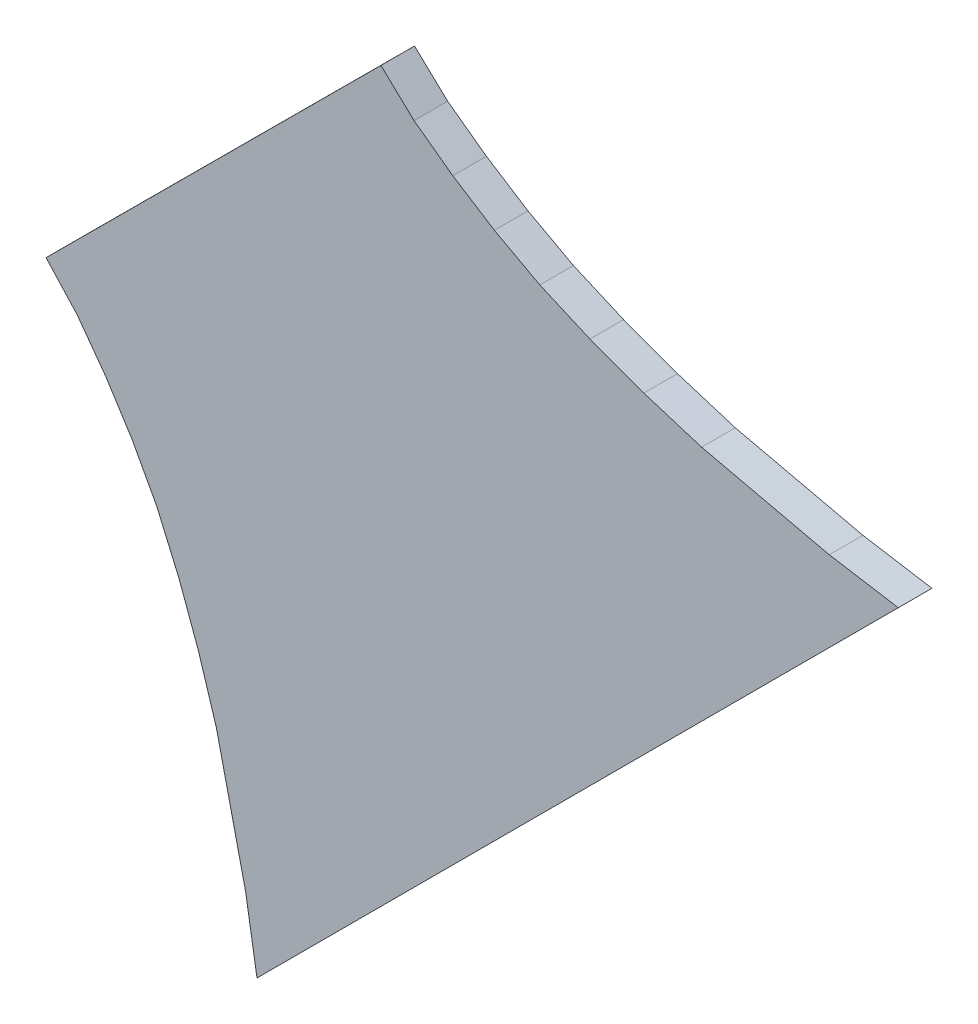
ISO-10303-21;
HEADER;
FILE_DESCRIPTION(('STEP AP214'),'2;1');
FILE_NAME('part.step','',(''),(''),'','','');
FILE_SCHEMA(('AUTOMOTIVE_DESIGN { 1 0 10303 214 1 1 1 1 }'));
ENDSEC;
DATA;
#1=APPLICATION_CONTEXT('core data for automotive mechanical design processes');
#2=APPLICATION_PROTOCOL_DEFINITION('international standard','automotive_design',2000,#1);
#3=PRODUCT_CONTEXT('',#1,'mechanical');
#4=PRODUCT('Part','Part','',(#3));
#5=PRODUCT_RELATED_PRODUCT_CATEGORY('part','',(#4));
#6=PRODUCT_DEFINITION_FORMATION('','',#4);
#7=PRODUCT_DEFINITION_CONTEXT('part definition',#1,'design');
#8=PRODUCT_DEFINITION('design','',#6,#7);
#9=PRODUCT_DEFINITION_SHAPE('','',#8);
#10=(LENGTH_UNIT() NAMED_UNIT(*) SI_UNIT(.MILLI.,.METRE.));
#11=(NAMED_UNIT(*) PLANE_ANGLE_UNIT() SI_UNIT($,.RADIAN.));
#12=(NAMED_UNIT(*) SI_UNIT($,.STERADIAN.) SOLID_ANGLE_UNIT());
#13=UNCERTAINTY_MEASURE_WITH_UNIT(LENGTH_MEASURE(1.E-05),#10,'distance_accuracy_value','');
#14=(GEOMETRIC_REPRESENTATION_CONTEXT(3) GLOBAL_UNCERTAINTY_ASSIGNED_CONTEXT((#13)) GLOBAL_UNIT_ASSIGNED_CONTEXT((#10,
#11,#12)) REPRESENTATION_CONTEXT('',''));
#15=CARTESIAN_POINT('',(0.,0.,0.));
#16=DIRECTION('',(0.,0.,1.));
#17=DIRECTION('',(1.,0.,0.));
#18=AXIS2_PLACEMENT_3D('',#15,#16,#17);
#19=CARTESIAN_POINT('',(119.383003234863,98.3040008544922,0.));
#20=DIRECTION('',(0.73721249970218,0.675660958086867,0.));
#21=DIRECTION('',(0.675660958086867,-0.73721249970218,0.));
#22=AXIS2_PLACEMENT_3D('',#19,#20,#21);
#23=PLANE('',#22);
#24=DIRECTION('',(0.675660958086867,-0.73721249970218,0.));
#25=VECTOR('',#24,1.);
#26=CARTESIAN_POINT('',(119.383003234863,98.3040008544922,0.03556));
#27=LINE('',#26,#25);
#28=CARTESIAN_POINT('',(119.383003234863,98.3040008544922,0.03556));
#29=VERTEX_POINT('',#28);
#30=CARTESIAN_POINT('',(119.416000366211,98.2679977416992,0.03556));
#31=VERTEX_POINT('',#30);
#32=EDGE_CURVE('E11',#29,#31,#27,.T.);
#33=ORIENTED_EDGE('',*,*,#32,.F.);
#34=DIRECTION('',(0.,0.,1.));
#35=VECTOR('',#34,1.);
#36=CARTESIAN_POINT('',(119.383003234863,98.3040008544922,0.));
#37=LINE('',#36,#35);
#38=CARTESIAN_POINT('',(119.383003234863,98.3040008544922,0.));
#39=VERTEX_POINT('',#38);
#40=EDGE_CURVE('E24',#39,#29,#37,.T.);
#41=ORIENTED_EDGE('',*,*,#40,.F.);
#42=DIRECTION('',(0.675660958086867,-0.73721249970218,0.));
#43=VECTOR('',#42,1.);
#44=CARTESIAN_POINT('',(119.383003234863,98.3040008544922,0.));
#45=LINE('',#44,#43);
#46=CARTESIAN_POINT('',(119.416000366211,98.2679977416992,0.));
#47=VERTEX_POINT('',#46);
#48=EDGE_CURVE('E172',#39,#47,#45,.T.);
#49=ORIENTED_EDGE('',*,*,#48,.T.);
#50=DIRECTION('',(0.,0.,1.));
#51=VECTOR('',#50,1.);
#52=CARTESIAN_POINT('',(119.416000366211,98.2679977416992,0.));
#53=LINE('',#52,#51);
#54=EDGE_CURVE('E37',#47,#31,#53,.T.);
#55=ORIENTED_EDGE('',*,*,#54,.T.);
#56=EDGE_LOOP('',(#33,#41,#49,#55));
#57=FACE_BOUND('',#56,.T.);
#58=ADVANCED_FACE('F17',(#57),#23,.F.);
#59=CARTESIAN_POINT('',(119.416000366211,98.2679977416992,0.));
#60=DIRECTION('',(0.807044289854115,0.590490909509933,0.));
#61=DIRECTION('',(0.590490909509933,-0.807044289854115,0.));
#62=AXIS2_PLACEMENT_3D('',#59,#60,#61);
#63=PLANE('',#62);
#64=DIRECTION('',(0.590490909509933,-0.807044289854115,0.));
#65=VECTOR('',#64,1.);
#66=CARTESIAN_POINT('',(119.416000366211,98.2679977416992,0.03556));
#67=LINE('',#66,#65);
#68=CARTESIAN_POINT('',(119.445999145508,98.2269973754883,0.03556));
#69=VERTEX_POINT('',#68);
#70=EDGE_CURVE('E308',#31,#69,#67,.T.);
#71=ORIENTED_EDGE('',*,*,#70,.F.);
#72=ORIENTED_EDGE('',*,*,#54,.F.);
#73=DIRECTION('',(0.590490909509933,-0.807044289854115,0.));
#74=VECTOR('',#73,1.);
#75=CARTESIAN_POINT('',(119.416000366211,98.2679977416992,0.));
#76=LINE('',#75,#74);
#77=CARTESIAN_POINT('',(119.445999145508,98.2269973754883,0.));
#78=VERTEX_POINT('',#77);
#79=EDGE_CURVE('E305',#47,#78,#76,.T.);
#80=ORIENTED_EDGE('',*,*,#79,.T.);
#81=DIRECTION('',(0.,0.,1.));
#82=VECTOR('',#81,1.);
#83=CARTESIAN_POINT('',(119.445999145508,98.2269973754883,0.));
#84=LINE('',#83,#82);
#85=EDGE_CURVE('E303',#78,#69,#84,.T.);
#86=ORIENTED_EDGE('',*,*,#85,.T.);
#87=EDGE_LOOP('',(#71,#72,#80,#86));
#88=FACE_BOUND('',#87,.T.);
#89=ADVANCED_FACE('F316',(#88),#63,.F.);
#90=CARTESIAN_POINT('',(119.445999145508,98.2269973754883,0.));
#91=DIRECTION('',(0.84365546396574,0.536884957994497,0.));
#92=DIRECTION('',(0.536884957994497,-0.84365546396574,0.));
#93=AXIS2_PLACEMENT_3D('',#90,#91,#92);
#94=PLANE('',#93);
#95=DIRECTION('',(0.536884957994497,-0.84365546396574,0.));
#96=VECTOR('',#95,1.);
#97=CARTESIAN_POINT('',(119.445999145508,98.2269973754883,0.03556));
#98=LINE('',#97,#96);
#99=CARTESIAN_POINT('',(119.473999023438,98.1829986572266,0.03556));
#100=VERTEX_POINT('',#99);
#101=EDGE_CURVE('E300',#69,#100,#98,.T.);
#102=ORIENTED_EDGE('',*,*,#101,.F.);
#103=ORIENTED_EDGE('',*,*,#85,.F.);
#104=DIRECTION('',(0.536884957994497,-0.84365546396574,0.));
#105=VECTOR('',#104,1.);
#106=CARTESIAN_POINT('',(119.445999145508,98.2269973754883,0.));
#107=LINE('',#106,#105);
#108=CARTESIAN_POINT('',(119.473999023438,98.1829986572266,0.));
#109=VERTEX_POINT('',#108);
#110=EDGE_CURVE('E297',#78,#109,#107,.T.);
#111=ORIENTED_EDGE('',*,*,#110,.T.);
#112=DIRECTION('',(0.,0.,1.));
#113=VECTOR('',#112,1.);
#114=CARTESIAN_POINT('',(119.473999023438,98.1829986572266,0.));
#115=LINE('',#114,#113);
#116=EDGE_CURVE('E295',#109,#100,#115,.T.);
#117=ORIENTED_EDGE('',*,*,#116,.T.);
#118=EDGE_LOOP('',(#102,#103,#111,#117));
#119=FACE_BOUND('',#118,.T.);
#120=ADVANCED_FACE('F322',(#119),#94,.F.);
#121=CARTESIAN_POINT('',(119.473999023438,98.1829986572266,0.));
#122=DIRECTION('',(0.879270015722156,0.476323670891926,0.));
#123=DIRECTION('',(0.476323670891926,-0.879270015722156,0.));
#124=AXIS2_PLACEMENT_3D('',#121,#122,#123);
#125=PLANE('',#124);
#126=DIRECTION('',(0.476323670891926,-0.879270015722156,0.));
#127=VECTOR('',#126,1.);
#128=CARTESIAN_POINT('',(119.473999023438,98.1829986572266,0.03556));
#129=LINE('',#128,#127);
#130=CARTESIAN_POINT('',(119.5,98.1350021362305,0.03556));
#131=VERTEX_POINT('',#130);
#132=EDGE_CURVE('E292',#100,#131,#129,.T.);
#133=ORIENTED_EDGE('',*,*,#132,.F.);
#134=ORIENTED_EDGE('',*,*,#116,.F.);
#135=DIRECTION('',(0.476323670891926,-0.879270015722156,0.));
#136=VECTOR('',#135,1.);
#137=CARTESIAN_POINT('',(119.473999023438,98.1829986572266,0.));
#138=LINE('',#137,#136);
#139=CARTESIAN_POINT('',(119.5,98.1350021362305,0.));
#140=VERTEX_POINT('',#139);
#141=EDGE_CURVE('E289',#109,#140,#138,.T.);
#142=ORIENTED_EDGE('',*,*,#141,.T.);
#143=DIRECTION('',(0.,0.,1.));
#144=VECTOR('',#143,1.);
#145=CARTESIAN_POINT('',(119.5,98.1350021362305,0.));
#146=LINE('',#145,#144);
#147=EDGE_CURVE('E287',#140,#131,#146,.T.);
#148=ORIENTED_EDGE('',*,*,#147,.T.);
#149=EDGE_LOOP('',(#133,#134,#142,#148));
#150=FACE_BOUND('',#149,.T.);
#151=ADVANCED_FACE('F324',(#150),#125,.F.);
#152=CARTESIAN_POINT('',(119.5,98.1350021362305,0.));
#153=DIRECTION('',(0.917332272694855,0.398122470444075,0.));
#154=DIRECTION('',(0.398122470444075,-0.917332272694855,0.));
#155=AXIS2_PLACEMENT_3D('',#152,#153,#154);
#156=PLANE('',#155);
#157=DIRECTION('',(0.398122470444075,-0.917332272694855,0.));
#158=VECTOR('',#157,1.);
#159=CARTESIAN_POINT('',(119.5,98.1350021362305,0.03556));
#160=LINE('',#159,#158);
#161=CARTESIAN_POINT('',(119.523002624512,98.0820007324219,0.03556));
#162=VERTEX_POINT('',#161);
#163=EDGE_CURVE('E284',#131,#162,#160,.T.);
#164=ORIENTED_EDGE('',*,*,#163,.F.);
#165=ORIENTED_EDGE('',*,*,#147,.F.);
#166=DIRECTION('',(0.398122470444075,-0.917332272694855,0.));
#167=VECTOR('',#166,1.);
#168=CARTESIAN_POINT('',(119.5,98.1350021362305,0.));
#169=LINE('',#168,#167);
#170=CARTESIAN_POINT('',(119.523002624512,98.0820007324219,0.));
#171=VERTEX_POINT('',#170);
#172=EDGE_CURVE('E281',#140,#171,#169,.T.);
#173=ORIENTED_EDGE('',*,*,#172,.T.);
#174=DIRECTION('',(0.,0.,1.));
#175=VECTOR('',#174,1.);
#176=CARTESIAN_POINT('',(119.523002624512,98.0820007324219,0.));
#177=LINE('',#176,#175);
#178=EDGE_CURVE('E279',#171,#162,#177,.T.);
#179=ORIENTED_EDGE('',*,*,#178,.T.);
#180=EDGE_LOOP('',(#164,#165,#173,#179));
#181=FACE_BOUND('',#180,.T.);
#182=ADVANCED_FACE('F329',(#181),#156,.F.);
#183=CARTESIAN_POINT('',(119.523002624512,98.0820007324219,0.));
#184=DIRECTION('',(0.938362414966103,0.345652973629597,0.));
#185=DIRECTION('',(0.345652973629597,-0.938362414966103,0.));
#186=AXIS2_PLACEMENT_3D('',#183,#184,#185);
#187=PLANE('',#186);
#188=DIRECTION('',(0.345652973629597,-0.938362414966103,0.));
#189=VECTOR('',#188,1.);
#190=CARTESIAN_POINT('',(119.523002624512,98.0820007324219,0.03556));
#191=LINE('',#190,#189);
#192=CARTESIAN_POINT('',(119.543998718262,98.0250015258789,0.03556));
#193=VERTEX_POINT('',#192);
#194=EDGE_CURVE('E276',#162,#193,#191,.T.);
#195=ORIENTED_EDGE('',*,*,#194,.F.);
#196=ORIENTED_EDGE('',*,*,#178,.F.);
#197=DIRECTION('',(0.345652973629597,-0.938362414966103,0.));
#198=VECTOR('',#197,1.);
#199=CARTESIAN_POINT('',(119.523002624512,98.0820007324219,0.));
#200=LINE('',#199,#198);
#201=CARTESIAN_POINT('',(119.543998718262,98.0250015258789,0.));
#202=VERTEX_POINT('',#201);
#203=EDGE_CURVE('E273',#171,#202,#200,.T.);
#204=ORIENTED_EDGE('',*,*,#203,.T.);
#205=DIRECTION('',(0.,0.,1.));
#206=VECTOR('',#205,1.);
#207=CARTESIAN_POINT('',(119.543998718262,98.0250015258789,0.));
#208=LINE('',#207,#206);
#209=EDGE_CURVE('E271',#202,#193,#208,.T.);
#210=ORIENTED_EDGE('',*,*,#209,.T.);
#211=EDGE_LOOP('',(#195,#196,#204,#210));
#212=FACE_BOUND('',#211,.T.);
#213=ADVANCED_FACE('F332',(#212),#187,.F.);
#214=CARTESIAN_POINT('',(119.543998718262,98.0250015258789,0.));
#215=DIRECTION('',(0.954743056267574,0.297431835062847,0.));
#216=DIRECTION('',(0.297431835062847,-0.954743056267574,0.));
#217=AXIS2_PLACEMENT_3D('',#214,#215,#216);
#218=PLANE('',#217);
#219=DIRECTION('',(0.297431835062847,-0.954743056267574,0.));
#220=VECTOR('',#219,1.);
#221=CARTESIAN_POINT('',(119.543998718262,98.0250015258789,0.03556));
#222=LINE('',#221,#220);
#223=CARTESIAN_POINT('',(119.563003540039,97.963996887207,0.03556));
#224=VERTEX_POINT('',#223);
#225=EDGE_CURVE('E268',#193,#224,#222,.T.);
#226=ORIENTED_EDGE('',*,*,#225,.F.);
#227=ORIENTED_EDGE('',*,*,#209,.F.);
#228=DIRECTION('',(0.297431835062847,-0.954743056267574,0.));
#229=VECTOR('',#228,1.);
#230=CARTESIAN_POINT('',(119.543998718262,98.0250015258789,0.));
#231=LINE('',#230,#229);
#232=CARTESIAN_POINT('',(119.563003540039,97.963996887207,0.));
#233=VERTEX_POINT('',#232);
#234=EDGE_CURVE('E265',#202,#233,#231,.T.);
#235=ORIENTED_EDGE('',*,*,#234,.T.);
#236=DIRECTION('',(0.,0.,1.));
#237=VECTOR('',#236,1.);
#238=CARTESIAN_POINT('',(119.563003540039,97.963996887207,0.));
#239=LINE('',#238,#237);
#240=EDGE_CURVE('E263',#233,#224,#239,.T.);
#241=ORIENTED_EDGE('',*,*,#240,.T.);
#242=EDGE_LOOP('',(#226,#227,#235,#241));
#243=FACE_BOUND('',#242,.T.);
#244=ADVANCED_FACE('F337',(#243),#218,.F.);
#245=CARTESIAN_POINT('',(119.563003540039,97.963996887207,0.));
#246=DIRECTION('',(0.97463478036029,0.223801351452688,0.));
#247=DIRECTION('',(0.223801351452688,-0.97463478036029,0.));
#248=AXIS2_PLACEMENT_3D('',#245,#246,#247);
#249=PLANE('',#248);
#250=DIRECTION('',(0.223801351452688,-0.97463478036029,0.));
#251=VECTOR('',#250,1.);
#252=CARTESIAN_POINT('',(119.563003540039,97.963996887207,0.03556));
#253=LINE('',#252,#251);
#254=CARTESIAN_POINT('',(119.59400177002,97.8290023803711,0.03556));
#255=VERTEX_POINT('',#254);
#256=EDGE_CURVE('E260',#224,#255,#253,.T.);
#257=ORIENTED_EDGE('',*,*,#256,.F.);
#258=ORIENTED_EDGE('',*,*,#240,.F.);
#259=DIRECTION('',(0.223801351452688,-0.97463478036029,0.));
#260=VECTOR('',#259,1.);
#261=CARTESIAN_POINT('',(119.563003540039,97.963996887207,0.));
#262=LINE('',#261,#260);
#263=CARTESIAN_POINT('',(119.59400177002,97.8290023803711,0.));
#264=VERTEX_POINT('',#263);
#265=EDGE_CURVE('E257',#233,#264,#262,.T.);
#266=ORIENTED_EDGE('',*,*,#265,.T.);
#267=DIRECTION('',(0.,0.,1.));
#268=VECTOR('',#267,1.);
#269=CARTESIAN_POINT('',(119.59400177002,97.8290023803711,0.));
#270=LINE('',#269,#268);
#271=EDGE_CURVE('E255',#264,#255,#270,.T.);
#272=ORIENTED_EDGE('',*,*,#271,.T.);
#273=EDGE_LOOP('',(#257,#258,#266,#272));
#274=FACE_BOUND('',#273,.T.);
#275=ADVANCED_FACE('F340',(#274),#249,.F.);
#276=CARTESIAN_POINT('',(119.59400177002,97.8290023803711,0.));
#277=DIRECTION('',(0.986756592381173,0.16220797573577,0.));
#278=DIRECTION('',(0.16220797573577,-0.986756592381173,0.));
#279=AXIS2_PLACEMENT_3D('',#276,#277,#278);
#280=PLANE('',#279);
#281=DIRECTION('',(0.16220797573577,-0.986756592381173,0.));
#282=VECTOR('',#281,1.);
#283=CARTESIAN_POINT('',(119.59400177002,97.8290023803711,0.03556));
#284=LINE('',#283,#282);
#285=CARTESIAN_POINT('',(119.606002807617,97.7559967041016,0.03556));
#286=VERTEX_POINT('',#285);
#287=EDGE_CURVE('E252',#255,#286,#284,.T.);
#288=ORIENTED_EDGE('',*,*,#287,.F.);
#289=ORIENTED_EDGE('',*,*,#271,.F.);
#290=DIRECTION('',(0.16220797573577,-0.986756592381173,0.));
#291=VECTOR('',#290,1.);
#292=CARTESIAN_POINT('',(119.59400177002,97.8290023803711,0.));
#293=LINE('',#292,#291);
#294=CARTESIAN_POINT('',(119.606002807617,97.7559967041016,0.));
#295=VERTEX_POINT('',#294);
#296=EDGE_CURVE('E249',#264,#295,#293,.T.);
#297=ORIENTED_EDGE('',*,*,#296,.T.);
#298=DIRECTION('',(0.,0.,1.));
#299=VECTOR('',#298,1.);
#300=CARTESIAN_POINT('',(119.606002807617,97.7559967041016,0.));
#301=LINE('',#300,#299);
#302=EDGE_CURVE('E247',#295,#286,#301,.T.);
#303=ORIENTED_EDGE('',*,*,#302,.T.);
#304=EDGE_LOOP('',(#288,#289,#297,#303));
#305=FACE_BOUND('',#304,.T.);
#306=ADVANCED_FACE('F345',(#305),#280,.F.);
#307=CARTESIAN_POINT('',(119.606002807617,97.7559967041016,0.));
#308=DIRECTION('',(-0.707110759653078,0.707102802697632,0.));
#309=DIRECTION('',(0.707102802697632,0.707110759653078,0.));
#310=AXIS2_PLACEMENT_3D('',#307,#308,#309);
#311=PLANE('',#310);
#312=DIRECTION('',(0.707102802697632,0.707110759653078,0.));
#313=VECTOR('',#312,1.);
#314=CARTESIAN_POINT('',(119.606002807617,97.7559967041016,0.03556));
#315=LINE('',#314,#313);
#316=CARTESIAN_POINT('',(120.283996582031,98.4339981079102,0.03556));
#317=VERTEX_POINT('',#316);
#318=EDGE_CURVE('E244',#286,#317,#315,.T.);
#319=ORIENTED_EDGE('',*,*,#318,.F.);
#320=ORIENTED_EDGE('',*,*,#302,.F.);
#321=DIRECTION('',(0.707102802697632,0.707110759653078,0.));
#322=VECTOR('',#321,1.);
#323=CARTESIAN_POINT('',(119.606002807617,97.7559967041016,0.));
#324=LINE('',#323,#322);
#325=CARTESIAN_POINT('',(120.283996582031,98.4339981079102,0.));
#326=VERTEX_POINT('',#325);
#327=EDGE_CURVE('E241',#295,#326,#324,.T.);
#328=ORIENTED_EDGE('',*,*,#327,.T.);
#329=DIRECTION('',(0.,0.,1.));
#330=VECTOR('',#329,1.);
#331=CARTESIAN_POINT('',(120.283996582031,98.4339981079102,0.));
#332=LINE('',#331,#330);
#333=EDGE_CURVE('E239',#326,#317,#332,.T.);
#334=ORIENTED_EDGE('',*,*,#333,.T.);
#335=EDGE_LOOP('',(#319,#320,#328,#334));
#336=FACE_BOUND('',#335,.T.);
#337=ADVANCED_FACE('F348',(#336),#311,.F.);
#338=CARTESIAN_POINT('',(120.283996582031,98.4339981079102,0.));
#339=DIRECTION('',(-0.162224482780174,-0.98675387872899,0.));
#340=DIRECTION('',(-0.98675387872899,0.162224482780174,0.));
#341=AXIS2_PLACEMENT_3D('',#338,#339,#340);
#342=PLANE('',#341);
#343=DIRECTION('',(-0.98675387872899,0.162224482780174,0.));
#344=VECTOR('',#343,1.);
#345=CARTESIAN_POINT('',(120.283996582031,98.4339981079102,0.03556));
#346=LINE('',#345,#344);
#347=CARTESIAN_POINT('',(120.210998535156,98.4459991455078,0.03556));
#348=VERTEX_POINT('',#347);
#349=EDGE_CURVE('E236',#317,#348,#346,.T.);
#350=ORIENTED_EDGE('',*,*,#349,.F.);
#351=ORIENTED_EDGE('',*,*,#333,.F.);
#352=DIRECTION('',(-0.98675387872899,0.162224482780174,0.));
#353=VECTOR('',#352,1.);
#354=CARTESIAN_POINT('',(120.283996582031,98.4339981079102,0.));
#355=LINE('',#354,#353);
#356=CARTESIAN_POINT('',(120.210998535156,98.4459991455078,0.));
#357=VERTEX_POINT('',#356);
#358=EDGE_CURVE('E233',#326,#357,#355,.T.);
#359=ORIENTED_EDGE('',*,*,#358,.T.);
#360=DIRECTION('',(0.,0.,1.));
#361=VECTOR('',#360,1.);
#362=CARTESIAN_POINT('',(120.210998535156,98.4459991455078,0.));
#363=LINE('',#362,#361);
#364=EDGE_CURVE('E231',#357,#348,#363,.T.);
#365=ORIENTED_EDGE('',*,*,#364,.T.);
#366=EDGE_LOOP('',(#350,#351,#359,#365));
#367=FACE_BOUND('',#366,.T.);
#368=ADVANCED_FACE('F353',(#367),#342,.F.);
#369=CARTESIAN_POINT('',(120.210998535156,98.4459991455078,0.));
#370=DIRECTION('',(-0.223789337171493,-0.97463753907201,0.));
#371=DIRECTION('',(-0.97463753907201,0.223789337171493,0.));
#372=AXIS2_PLACEMENT_3D('',#369,#370,#371);
#373=PLANE('',#372);
#374=DIRECTION('',(-0.97463753907201,0.223789337171493,0.));
#375=VECTOR('',#374,1.);
#376=CARTESIAN_POINT('',(120.210998535156,98.4459991455078,0.03556));
#377=LINE('',#376,#375);
#378=CARTESIAN_POINT('',(120.075996398926,98.4769973754883,0.03556));
#379=VERTEX_POINT('',#378);
#380=EDGE_CURVE('E228',#348,#379,#377,.T.);
#381=ORIENTED_EDGE('',*,*,#380,.F.);
#382=ORIENTED_EDGE('',*,*,#364,.F.);
#383=DIRECTION('',(-0.97463753907201,0.223789337171493,0.));
#384=VECTOR('',#383,1.);
#385=CARTESIAN_POINT('',(120.210998535156,98.4459991455078,0.));
#386=LINE('',#385,#384);
#387=CARTESIAN_POINT('',(120.075996398926,98.4769973754883,0.));
#388=VERTEX_POINT('',#387);
#389=EDGE_CURVE('E225',#357,#388,#386,.T.);
#390=ORIENTED_EDGE('',*,*,#389,.T.);
#391=DIRECTION('',(0.,0.,1.));
#392=VECTOR('',#391,1.);
#393=CARTESIAN_POINT('',(120.075996398926,98.4769973754883,0.));
#394=LINE('',#393,#392);
#395=EDGE_CURVE('E223',#388,#379,#394,.T.);
#396=ORIENTED_EDGE('',*,*,#395,.T.);
#397=EDGE_LOOP('',(#381,#382,#390,#396));
#398=FACE_BOUND('',#397,.T.);
#399=ADVANCED_FACE('F356',(#398),#373,.F.);
#400=CARTESIAN_POINT('',(120.075996398926,98.4769973754883,0.));
#401=DIRECTION('',(-0.297465745609508,-0.954732491428347,0.));
#402=DIRECTION('',(-0.954732491428347,0.297465745609508,0.));
#403=AXIS2_PLACEMENT_3D('',#400,#401,#402);
#404=PLANE('',#403);
#405=DIRECTION('',(-0.954732491428347,0.297465745609508,0.));
#406=VECTOR('',#405,1.);
#407=CARTESIAN_POINT('',(120.075996398926,98.4769973754883,0.03556));
#408=LINE('',#407,#406);
#409=CARTESIAN_POINT('',(120.014999389648,98.4960021972656,0.03556));
#410=VERTEX_POINT('',#409);
#411=EDGE_CURVE('E220',#379,#410,#408,.T.);
#412=ORIENTED_EDGE('',*,*,#411,.F.);
#413=ORIENTED_EDGE('',*,*,#395,.F.);
#414=DIRECTION('',(-0.954732491428347,0.297465745609508,0.));
#415=VECTOR('',#414,1.);
#416=CARTESIAN_POINT('',(120.075996398926,98.4769973754883,0.));
#417=LINE('',#416,#415);
#418=CARTESIAN_POINT('',(120.014999389648,98.4960021972656,0.));
#419=VERTEX_POINT('',#418);
#420=EDGE_CURVE('E217',#388,#419,#417,.T.);
#421=ORIENTED_EDGE('',*,*,#420,.T.);
#422=DIRECTION('',(0.,0.,1.));
#423=VECTOR('',#422,1.);
#424=CARTESIAN_POINT('',(120.014999389648,98.4960021972656,0.));
#425=LINE('',#424,#423);
#426=EDGE_CURVE('E215',#419,#410,#425,.T.);
#427=ORIENTED_EDGE('',*,*,#426,.T.);
#428=EDGE_LOOP('',(#412,#413,#421,#427));
#429=FACE_BOUND('',#428,.T.);
#430=ADVANCED_FACE('F361',(#429),#404,.F.);
#431=CARTESIAN_POINT('',(120.014999389648,98.4960021972656,0.));
#432=DIRECTION('',(-0.345652973629597,-0.938362414966103,0.));
#433=DIRECTION('',(-0.938362414966103,0.345652973629597,0.));
#434=AXIS2_PLACEMENT_3D('',#431,#432,#433);
#435=PLANE('',#434);
#436=DIRECTION('',(-0.938362414966103,0.345652973629597,0.));
#437=VECTOR('',#436,1.);
#438=CARTESIAN_POINT('',(120.014999389648,98.4960021972656,0.03556));
#439=LINE('',#438,#437);
#440=CARTESIAN_POINT('',(119.958000183105,98.5169982910156,0.03556));
#441=VERTEX_POINT('',#440);
#442=EDGE_CURVE('E212',#410,#441,#439,.T.);
#443=ORIENTED_EDGE('',*,*,#442,.F.);
#444=ORIENTED_EDGE('',*,*,#426,.F.);
#445=DIRECTION('',(-0.938362414966103,0.345652973629597,0.));
#446=VECTOR('',#445,1.);
#447=CARTESIAN_POINT('',(120.014999389648,98.4960021972656,0.));
#448=LINE('',#447,#446);
#449=CARTESIAN_POINT('',(119.958000183105,98.5169982910156,0.));
#450=VERTEX_POINT('',#449);
#451=EDGE_CURVE('E209',#419,#450,#448,.T.);
#452=ORIENTED_EDGE('',*,*,#451,.T.);
#453=DIRECTION('',(0.,0.,1.));
#454=VECTOR('',#453,1.);
#455=CARTESIAN_POINT('',(119.958000183105,98.5169982910156,0.));
#456=LINE('',#455,#454);
#457=EDGE_CURVE('E207',#450,#441,#456,.T.);
#458=ORIENTED_EDGE('',*,*,#457,.T.);
#459=EDGE_LOOP('',(#443,#444,#452,#458));
#460=FACE_BOUND('',#459,.T.);
#461=ADVANCED_FACE('F364',(#460),#435,.F.);
#462=CARTESIAN_POINT('',(119.958000183105,98.5169982910156,0.));
#463=DIRECTION('',(-0.398122470444075,-0.917332272694855,0.));
#464=DIRECTION('',(-0.917332272694855,0.398122470444075,0.));
#465=AXIS2_PLACEMENT_3D('',#462,#463,#464);
#466=PLANE('',#465);
#467=DIRECTION('',(-0.917332272694855,0.398122470444075,0.));
#468=VECTOR('',#467,1.);
#469=CARTESIAN_POINT('',(119.958000183105,98.5169982910156,0.03556));
#470=LINE('',#469,#468);
#471=CARTESIAN_POINT('',(119.904998779297,98.5400009155273,0.03556));
#472=VERTEX_POINT('',#471);
#473=EDGE_CURVE('E204',#441,#472,#470,.T.);
#474=ORIENTED_EDGE('',*,*,#473,.F.);
#475=ORIENTED_EDGE('',*,*,#457,.F.);
#476=DIRECTION('',(-0.917332272694855,0.398122470444075,0.));
#477=VECTOR('',#476,1.);
#478=CARTESIAN_POINT('',(119.958000183105,98.5169982910156,0.));
#479=LINE('',#478,#477);
#480=CARTESIAN_POINT('',(119.904998779297,98.5400009155273,0.));
#481=VERTEX_POINT('',#480);
#482=EDGE_CURVE('E201',#450,#481,#479,.T.);
#483=ORIENTED_EDGE('',*,*,#482,.T.);
#484=DIRECTION('',(0.,0.,1.));
#485=VECTOR('',#484,1.);
#486=CARTESIAN_POINT('',(119.904998779297,98.5400009155273,0.));
#487=LINE('',#486,#485);
#488=EDGE_CURVE('E199',#481,#472,#487,.T.);
#489=ORIENTED_EDGE('',*,*,#488,.T.);
#490=EDGE_LOOP('',(#474,#475,#483,#489));
#491=FACE_BOUND('',#490,.T.);
#492=ADVANCED_FACE('F369',(#491),#466,.F.);
#493=CARTESIAN_POINT('',(119.904998779297,98.5400009155273,0.));
#494=DIRECTION('',(-0.476323670891926,-0.879270015722156,0.));
#495=DIRECTION('',(-0.879270015722156,0.476323670891926,0.));
#496=AXIS2_PLACEMENT_3D('',#493,#494,#495);
#497=PLANE('',#496);
#498=DIRECTION('',(-0.879270015722156,0.476323670891926,0.));
#499=VECTOR('',#498,1.);
#500=CARTESIAN_POINT('',(119.904998779297,98.5400009155273,0.03556));
#501=LINE('',#500,#499);
#502=CARTESIAN_POINT('',(119.857002258301,98.5660018920898,0.03556));
#503=VERTEX_POINT('',#502);
#504=EDGE_CURVE('E196',#472,#503,#501,.T.);
#505=ORIENTED_EDGE('',*,*,#504,.F.);
#506=ORIENTED_EDGE('',*,*,#488,.F.);
#507=DIRECTION('',(-0.879270015722156,0.476323670891926,0.));
#508=VECTOR('',#507,1.);
#509=CARTESIAN_POINT('',(119.904998779297,98.5400009155273,0.));
#510=LINE('',#509,#508);
#511=CARTESIAN_POINT('',(119.857002258301,98.5660018920898,0.));
#512=VERTEX_POINT('',#511);
#513=EDGE_CURVE('E193',#481,#512,#510,.T.);
#514=ORIENTED_EDGE('',*,*,#513,.T.);
#515=DIRECTION('',(0.,0.,1.));
#516=VECTOR('',#515,1.);
#517=CARTESIAN_POINT('',(119.857002258301,98.5660018920898,0.));
#518=LINE('',#517,#516);
#519=EDGE_CURVE('E191',#512,#503,#518,.T.);
#520=ORIENTED_EDGE('',*,*,#519,.T.);
#521=EDGE_LOOP('',(#505,#506,#514,#520));
#522=FACE_BOUND('',#521,.T.);
#523=ADVANCED_FACE('F372',(#522),#497,.F.);
#524=CARTESIAN_POINT('',(119.857002258301,98.5660018920898,0.));
#525=DIRECTION('',(-0.536884957994497,-0.84365546396574,0.));
#526=DIRECTION('',(-0.84365546396574,0.536884957994497,0.));
#527=AXIS2_PLACEMENT_3D('',#524,#525,#526);
#528=PLANE('',#527);
#529=DIRECTION('',(-0.84365546396574,0.536884957994497,0.));
#530=VECTOR('',#529,1.);
#531=CARTESIAN_POINT('',(119.857002258301,98.5660018920898,0.03556));
#532=LINE('',#531,#530);
#533=CARTESIAN_POINT('',(119.813003540039,98.5940017700195,0.03556));
#534=VERTEX_POINT('',#533);
#535=EDGE_CURVE('E188',#503,#534,#532,.T.);
#536=ORIENTED_EDGE('',*,*,#535,.F.);
#537=ORIENTED_EDGE('',*,*,#519,.F.);
#538=DIRECTION('',(-0.84365546396574,0.536884957994497,0.));
#539=VECTOR('',#538,1.);
#540=CARTESIAN_POINT('',(119.857002258301,98.5660018920898,0.));
#541=LINE('',#540,#539);
#542=CARTESIAN_POINT('',(119.813003540039,98.5940017700195,0.));
#543=VERTEX_POINT('',#542);
#544=EDGE_CURVE('E185',#512,#543,#541,.T.);
#545=ORIENTED_EDGE('',*,*,#544,.T.);
#546=DIRECTION('',(0.,0.,1.));
#547=VECTOR('',#546,1.);
#548=CARTESIAN_POINT('',(119.813003540039,98.5940017700195,0.));
#549=LINE('',#548,#547);
#550=EDGE_CURVE('E183',#543,#534,#549,.T.);
#551=ORIENTED_EDGE('',*,*,#550,.T.);
#552=EDGE_LOOP('',(#536,#537,#545,#551));
#553=FACE_BOUND('',#552,.T.);
#554=ADVANCED_FACE('F377',(#553),#528,.F.);
#555=CARTESIAN_POINT('',(119.813003540039,98.5940017700195,0.));
#556=DIRECTION('',(-0.590490909509933,-0.807044289854115,0.));
#557=DIRECTION('',(-0.807044289854115,0.590490909509933,0.));
#558=AXIS2_PLACEMENT_3D('',#555,#556,#557);
#559=PLANE('',#558);
#560=DIRECTION('',(-0.807044289854115,0.590490909509933,0.));
#561=VECTOR('',#560,1.);
#562=CARTESIAN_POINT('',(119.813003540039,98.5940017700195,0.03556));
#563=LINE('',#562,#561);
#564=CARTESIAN_POINT('',(119.772003173828,98.6240005493164,0.03556));
#565=VERTEX_POINT('',#564);
#566=EDGE_CURVE('E180',#534,#565,#563,.T.);
#567=ORIENTED_EDGE('',*,*,#566,.F.);
#568=ORIENTED_EDGE('',*,*,#550,.F.);
#569=DIRECTION('',(-0.807044289854115,0.590490909509933,0.));
#570=VECTOR('',#569,1.);
#571=CARTESIAN_POINT('',(119.813003540039,98.5940017700195,0.));
#572=LINE('',#571,#570);
#573=CARTESIAN_POINT('',(119.772003173828,98.6240005493164,0.));
#574=VERTEX_POINT('',#573);
#575=EDGE_CURVE('E178',#543,#574,#572,.T.);
#576=ORIENTED_EDGE('',*,*,#575,.T.);
#577=DIRECTION('',(0.,0.,1.));
#578=VECTOR('',#577,1.);
#579=CARTESIAN_POINT('',(119.772003173828,98.6240005493164,0.));
#580=LINE('',#579,#578);
#581=EDGE_CURVE('E163',#574,#565,#580,.T.);
#582=ORIENTED_EDGE('',*,*,#581,.T.);
#583=EDGE_LOOP('',(#567,#568,#576,#582));
#584=FACE_BOUND('',#583,.T.);
#585=ADVANCED_FACE('F379',(#584),#559,.F.);
#586=CARTESIAN_POINT('',(119.772003173828,98.6240005493164,0.));
#587=DIRECTION('',(-0.685943298310121,-0.727654994831639,0.));
#588=DIRECTION('',(-0.727654994831639,0.685943298310121,0.));
#589=AXIS2_PLACEMENT_3D('',#586,#587,#588);
#590=PLANE('',#589);
#591=DIRECTION('',(-0.727654994831639,0.685943298310121,0.));
#592=VECTOR('',#591,1.);
#593=CARTESIAN_POINT('',(119.772003173828,98.6240005493164,0.03556));
#594=LINE('',#593,#592);
#595=CARTESIAN_POINT('',(119.736999511719,98.6569976806641,0.03556));
#596=VERTEX_POINT('',#595);
#597=EDGE_CURVE('E167',#565,#596,#594,.T.);
#598=ORIENTED_EDGE('',*,*,#597,.F.);
#599=ORIENTED_EDGE('',*,*,#581,.F.);
#600=DIRECTION('',(-0.727654994831639,0.685943298310121,0.));
#601=VECTOR('',#600,1.);
#602=CARTESIAN_POINT('',(119.772003173828,98.6240005493164,0.));
#603=LINE('',#602,#601);
#604=CARTESIAN_POINT('',(119.736999511719,98.6569976806641,0.));
#605=VERTEX_POINT('',#604);
#606=EDGE_CURVE('E159',#574,#605,#603,.T.);
#607=ORIENTED_EDGE('',*,*,#606,.T.);
#608=DIRECTION('',(0.,0.,1.));
#609=VECTOR('',#608,1.);
#610=CARTESIAN_POINT('',(119.736999511719,98.6569976806641,0.));
#611=LINE('',#610,#609);
#612=EDGE_CURVE('E149',#605,#596,#611,.T.);
#613=ORIENTED_EDGE('',*,*,#612,.T.);
#614=EDGE_LOOP('',(#598,#599,#607,#613));
#615=FACE_BOUND('',#614,.T.);
#616=ADVANCED_FACE('F162',(#615),#590,.F.);
#617=CARTESIAN_POINT('',(119.736999511719,98.6569976806641,0.));
#618=DIRECTION('',(0.706106464242822,-0.708105685017781,0.));
#619=DIRECTION('',(-0.708105685017781,-0.706106464242822,0.));
#620=AXIS2_PLACEMENT_3D('',#617,#618,#619);
#621=PLANE('',#620);
#622=DIRECTION('',(-0.708105685017781,-0.706106464242822,0.));
#623=VECTOR('',#622,1.);
#624=CARTESIAN_POINT('',(119.736999511719,98.6569976806641,0.03556));
#625=LINE('',#624,#623);
#626=EDGE_CURVE('E155',#596,#29,#625,.T.);
#627=ORIENTED_EDGE('',*,*,#626,.F.);
#628=ORIENTED_EDGE('',*,*,#612,.F.);
#629=DIRECTION('',(-0.708105685017781,-0.706106464242822,0.));
#630=VECTOR('',#629,1.);
#631=CARTESIAN_POINT('',(119.736999511719,98.6569976806641,0.));
#632=LINE('',#631,#630);
#633=EDGE_CURVE('E153',#605,#39,#632,.T.);
#634=ORIENTED_EDGE('',*,*,#633,.T.);
#635=ORIENTED_EDGE('',*,*,#40,.T.);
#636=EDGE_LOOP('',(#627,#628,#634,#635));
#637=FACE_BOUND('',#636,.T.);
#638=ADVANCED_FACE('F151',(#637),#621,.F.);
#639=CARTESIAN_POINT('',(119.383003234863,98.3040008544922,0.));
#640=DIRECTION('',(0.,0.,1.));
#641=DIRECTION('',(1.,0.,0.));
#642=AXIS2_PLACEMENT_3D('',#639,#640,#641);
#643=PLANE('',#642);
#644=ORIENTED_EDGE('',*,*,#633,.F.);
#645=ORIENTED_EDGE('',*,*,#606,.F.);
#646=ORIENTED_EDGE('',*,*,#575,.F.);
#647=ORIENTED_EDGE('',*,*,#544,.F.);
#648=ORIENTED_EDGE('',*,*,#513,.F.);
#649=ORIENTED_EDGE('',*,*,#482,.F.);
#650=ORIENTED_EDGE('',*,*,#451,.F.);
#651=ORIENTED_EDGE('',*,*,#420,.F.);
#652=ORIENTED_EDGE('',*,*,#389,.F.);
#653=ORIENTED_EDGE('',*,*,#358,.F.);
#654=ORIENTED_EDGE('',*,*,#327,.F.);
#655=ORIENTED_EDGE('',*,*,#296,.F.);
#656=ORIENTED_EDGE('',*,*,#265,.F.);
#657=ORIENTED_EDGE('',*,*,#234,.F.);
#658=ORIENTED_EDGE('',*,*,#203,.F.);
#659=ORIENTED_EDGE('',*,*,#172,.F.);
#660=ORIENTED_EDGE('',*,*,#141,.F.);
#661=ORIENTED_EDGE('',*,*,#110,.F.);
#662=ORIENTED_EDGE('',*,*,#79,.F.);
#663=ORIENTED_EDGE('',*,*,#48,.F.);
#664=EDGE_LOOP('',(#644,#645,#646,#647,#648,#649,#650,#651,#652,#653,#654,#655,#656,#657,#658,
#659,#660,#661,#662,#663));
#665=FACE_BOUND('',#664,.T.);
#666=ADVANCED_FACE('F170',(#665),#643,.F.);
#667=CARTESIAN_POINT('',(119.383003234863,98.3040008544922,0.03556));
#668=DIRECTION('',(0.,0.,1.));
#669=DIRECTION('',(1.,0.,0.));
#670=AXIS2_PLACEMENT_3D('',#667,#668,#669);
#671=PLANE('',#670);
#672=ORIENTED_EDGE('',*,*,#32,.T.);
#673=ORIENTED_EDGE('',*,*,#70,.T.);
#674=ORIENTED_EDGE('',*,*,#101,.T.);
#675=ORIENTED_EDGE('',*,*,#132,.T.);
#676=ORIENTED_EDGE('',*,*,#163,.T.);
#677=ORIENTED_EDGE('',*,*,#194,.T.);
#678=ORIENTED_EDGE('',*,*,#225,.T.);
#679=ORIENTED_EDGE('',*,*,#256,.T.);
#680=ORIENTED_EDGE('',*,*,#287,.T.);
#681=ORIENTED_EDGE('',*,*,#318,.T.);
#682=ORIENTED_EDGE('',*,*,#349,.T.);
#683=ORIENTED_EDGE('',*,*,#380,.T.);
#684=ORIENTED_EDGE('',*,*,#411,.T.);
#685=ORIENTED_EDGE('',*,*,#442,.T.);
#686=ORIENTED_EDGE('',*,*,#473,.T.);
#687=ORIENTED_EDGE('',*,*,#504,.T.);
#688=ORIENTED_EDGE('',*,*,#535,.T.);
#689=ORIENTED_EDGE('',*,*,#566,.T.);
#690=ORIENTED_EDGE('',*,*,#597,.T.);
#691=ORIENTED_EDGE('',*,*,#626,.T.);
#692=EDGE_LOOP('',(#672,#673,#674,#675,#676,#677,#678,#679,#680,#681,#682,#683,#684,#685,#686,
#687,#688,#689,#690,#691));
#693=FACE_BOUND('',#692,.T.);
#694=ADVANCED_FACE('F319',(#693),#671,.T.);
#695=CLOSED_SHELL('',(#58,#89,#120,#151,#182,#213,#244,#275,#306,#337,#368,#399,#430,#461,#492,
#523,#554,#585,#616,#638,#666,#694));
#696=MANIFOLD_SOLID_BREP('B1',#695);
#697=ADVANCED_BREP_SHAPE_REPRESENTATION('',(#18,#696),#14);
#698=SHAPE_DEFINITION_REPRESENTATION(#9,#697);
ENDSEC;
END-ISO-10303-21;
